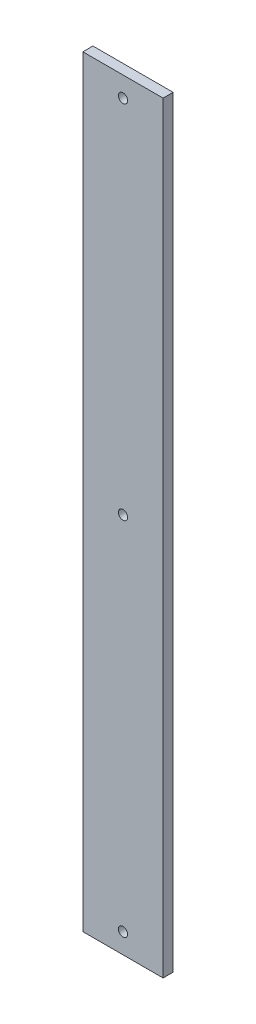
ISO-10303-21;
HEADER;
FILE_DESCRIPTION(('STEP AP214'),'2;1');
FILE_NAME('part.step','',(''),(''),'','','');
FILE_SCHEMA(('AUTOMOTIVE_DESIGN { 1 0 10303 214 1 1 1 1 }'));
ENDSEC;
DATA;
#1=APPLICATION_CONTEXT('core data for automotive mechanical design processes');
#2=APPLICATION_PROTOCOL_DEFINITION('international standard','automotive_design',2000,#1);
#3=PRODUCT_CONTEXT('',#1,'mechanical');
#4=PRODUCT('Part','Part','',(#3));
#5=PRODUCT_RELATED_PRODUCT_CATEGORY('part','',(#4));
#6=PRODUCT_DEFINITION_FORMATION('','',#4);
#7=PRODUCT_DEFINITION_CONTEXT('part definition',#1,'design');
#8=PRODUCT_DEFINITION('design','',#6,#7);
#9=PRODUCT_DEFINITION_SHAPE('','',#8);
#10=(LENGTH_UNIT() NAMED_UNIT(*) SI_UNIT(.MILLI.,.METRE.));
#11=(NAMED_UNIT(*) PLANE_ANGLE_UNIT() SI_UNIT($,.RADIAN.));
#12=(NAMED_UNIT(*) SI_UNIT($,.STERADIAN.) SOLID_ANGLE_UNIT());
#13=UNCERTAINTY_MEASURE_WITH_UNIT(LENGTH_MEASURE(1.E-05),#10,'distance_accuracy_value','');
#14=(GEOMETRIC_REPRESENTATION_CONTEXT(3) GLOBAL_UNCERTAINTY_ASSIGNED_CONTEXT((#13)) GLOBAL_UNIT_ASSIGNED_CONTEXT((#10,
#11,#12)) REPRESENTATION_CONTEXT('',''));
#15=CARTESIAN_POINT('',(0.,0.,0.));
#16=DIRECTION('',(0.,0.,1.));
#17=DIRECTION('',(1.,0.,0.));
#18=AXIS2_PLACEMENT_3D('',#15,#16,#17);
#19=CARTESIAN_POINT('',(0.,0.,3.175));
#20=DIRECTION('',(0.,0.,-1.));
#21=DIRECTION('',(-1.,0.,0.));
#22=AXIS2_PLACEMENT_3D('',#19,#20,#21);
#23=PLANE('',#22);
#24=DIRECTION('',(0.,-1.,0.));
#25=VECTOR('',#24,1.);
#26=CARTESIAN_POINT('',(0.,0.,3.175));
#27=LINE('',#26,#25);
#28=CARTESIAN_POINT('',(0.,241.3,3.175));
#29=VERTEX_POINT('',#28);
#30=CARTESIAN_POINT('',(0.,0.,3.175));
#31=VERTEX_POINT('',#30);
#32=EDGE_CURVE('E94',#29,#31,#27,.T.);
#33=ORIENTED_EDGE('',*,*,#32,.T.);
#34=DIRECTION('',(1.,0.,0.));
#35=VECTOR('',#34,1.);
#36=CARTESIAN_POINT('',(0.,0.,3.175));
#37=LINE('',#36,#35);
#38=CARTESIAN_POINT('',(25.4,0.,3.175));
#39=VERTEX_POINT('',#38);
#40=EDGE_CURVE('E89',#31,#39,#37,.T.);
#41=ORIENTED_EDGE('',*,*,#40,.T.);
#42=DIRECTION('',(0.,1.,0.));
#43=VECTOR('',#42,1.);
#44=CARTESIAN_POINT('',(25.4,0.,3.175));
#45=LINE('',#44,#43);
#46=CARTESIAN_POINT('',(25.4,241.3,3.175));
#47=VERTEX_POINT('',#46);
#48=EDGE_CURVE('E92',#39,#47,#45,.T.);
#49=ORIENTED_EDGE('',*,*,#48,.T.);
#50=DIRECTION('',(-1.,0.,0.));
#51=VECTOR('',#50,1.);
#52=CARTESIAN_POINT('',(0.,241.3,3.175));
#53=LINE('',#52,#51);
#54=EDGE_CURVE('E59',#47,#29,#53,.T.);
#55=ORIENTED_EDGE('',*,*,#54,.T.);
#56=EDGE_LOOP('',(#33,#41,#49,#55));
#57=FACE_BOUND('',#56,.T.);
#58=CARTESIAN_POINT('',(12.7,234.95,3.175));
#59=DIRECTION('',(0.,0.,1.));
#60=DIRECTION('',(1.,0.,0.));
#61=AXIS2_PLACEMENT_3D('',#58,#59,#60);
#62=CIRCLE('',#61,1.4605);
#63=CARTESIAN_POINT('',(14.1605,234.95,3.175));
#64=VERTEX_POINT('',#63);
#65=EDGE_CURVE('E109',#64,#64,#62,.T.);
#66=ORIENTED_EDGE('',*,*,#65,.F.);
#67=EDGE_LOOP('',(#66));
#68=FACE_BOUND('',#67,.T.);
#69=CARTESIAN_POINT('',(12.7,6.35,3.175));
#70=DIRECTION('',(0.,0.,1.));
#71=DIRECTION('',(1.,0.,0.));
#72=AXIS2_PLACEMENT_3D('',#69,#70,#71);
#73=CIRCLE('',#72,1.4605);
#74=CARTESIAN_POINT('',(14.1605,6.35,3.175));
#75=VERTEX_POINT('',#74);
#76=EDGE_CURVE('E124',#75,#75,#73,.T.);
#77=ORIENTED_EDGE('',*,*,#76,.F.);
#78=EDGE_LOOP('',(#77));
#79=FACE_BOUND('',#78,.T.);
#80=CARTESIAN_POINT('',(12.7,120.65,3.175));
#81=DIRECTION('',(0.,0.,1.));
#82=DIRECTION('',(1.,0.,0.));
#83=AXIS2_PLACEMENT_3D('',#80,#81,#82);
#84=CIRCLE('',#83,1.4605);
#85=CARTESIAN_POINT('',(14.1605,120.65,3.175));
#86=VERTEX_POINT('',#85);
#87=EDGE_CURVE('E130',#86,#86,#84,.T.);
#88=ORIENTED_EDGE('',*,*,#87,.F.);
#89=EDGE_LOOP('',(#88));
#90=FACE_BOUND('',#89,.T.);
#91=ADVANCED_FACE('F42',(#57,#68,#79,#90),#23,.F.);
#92=CARTESIAN_POINT('',(0.,0.,0.));
#93=DIRECTION('',(0.,0.,-1.));
#94=DIRECTION('',(-1.,0.,0.));
#95=AXIS2_PLACEMENT_3D('',#92,#93,#94);
#96=PLANE('',#95);
#97=CARTESIAN_POINT('',(12.7,6.35,0.));
#98=DIRECTION('',(0.,0.,1.));
#99=DIRECTION('',(1.,0.,0.));
#100=AXIS2_PLACEMENT_3D('',#97,#98,#99);
#101=CIRCLE('',#100,1.4605);
#102=CARTESIAN_POINT('',(14.1605,6.35,0.));
#103=VERTEX_POINT('',#102);
#104=EDGE_CURVE('E127',#103,#103,#101,.T.);
#105=ORIENTED_EDGE('',*,*,#104,.T.);
#106=EDGE_LOOP('',(#105));
#107=FACE_BOUND('',#106,.T.);
#108=DIRECTION('',(0.,-1.,0.));
#109=VECTOR('',#108,1.);
#110=CARTESIAN_POINT('',(0.,0.,0.));
#111=LINE('',#110,#109);
#112=CARTESIAN_POINT('',(0.,241.3,0.));
#113=VERTEX_POINT('',#112);
#114=CARTESIAN_POINT('',(0.,0.,0.));
#115=VERTEX_POINT('',#114);
#116=EDGE_CURVE('E106',#113,#115,#111,.T.);
#117=ORIENTED_EDGE('',*,*,#116,.F.);
#118=DIRECTION('',(-1.,0.,0.));
#119=VECTOR('',#118,1.);
#120=CARTESIAN_POINT('',(0.,241.3,0.));
#121=LINE('',#120,#119);
#122=CARTESIAN_POINT('',(25.4,241.3,0.));
#123=VERTEX_POINT('',#122);
#124=EDGE_CURVE('E82',#123,#113,#121,.T.);
#125=ORIENTED_EDGE('',*,*,#124,.F.);
#126=DIRECTION('',(0.,1.,0.));
#127=VECTOR('',#126,1.);
#128=CARTESIAN_POINT('',(25.4,0.,0.));
#129=LINE('',#128,#127);
#130=CARTESIAN_POINT('',(25.4,0.,0.));
#131=VERTEX_POINT('',#130);
#132=EDGE_CURVE('E76',#131,#123,#129,.T.);
#133=ORIENTED_EDGE('',*,*,#132,.F.);
#134=DIRECTION('',(1.,0.,0.));
#135=VECTOR('',#134,1.);
#136=CARTESIAN_POINT('',(0.,0.,0.));
#137=LINE('',#136,#135);
#138=EDGE_CURVE('E98',#115,#131,#137,.T.);
#139=ORIENTED_EDGE('',*,*,#138,.F.);
#140=EDGE_LOOP('',(#117,#125,#133,#139));
#141=FACE_BOUND('',#140,.T.);
#142=CARTESIAN_POINT('',(12.7,234.95,0.));
#143=DIRECTION('',(0.,0.,1.));
#144=DIRECTION('',(1.,0.,0.));
#145=AXIS2_PLACEMENT_3D('',#142,#143,#144);
#146=CIRCLE('',#145,1.4605);
#147=CARTESIAN_POINT('',(14.1605,234.95,0.));
#148=VERTEX_POINT('',#147);
#149=EDGE_CURVE('E121',#148,#148,#146,.T.);
#150=ORIENTED_EDGE('',*,*,#149,.T.);
#151=EDGE_LOOP('',(#150));
#152=FACE_BOUND('',#151,.T.);
#153=CARTESIAN_POINT('',(12.7,120.65,0.));
#154=DIRECTION('',(0.,0.,1.));
#155=DIRECTION('',(1.,0.,0.));
#156=AXIS2_PLACEMENT_3D('',#153,#154,#155);
#157=CIRCLE('',#156,1.4605);
#158=CARTESIAN_POINT('',(14.1605,120.65,0.));
#159=VERTEX_POINT('',#158);
#160=EDGE_CURVE('E133',#159,#159,#157,.T.);
#161=ORIENTED_EDGE('',*,*,#160,.T.);
#162=EDGE_LOOP('',(#161));
#163=FACE_BOUND('',#162,.T.);
#164=ADVANCED_FACE('F117',(#107,#141,#152,#163),#96,.T.);
#165=CARTESIAN_POINT('',(0.,0.,3.175));
#166=DIRECTION('',(1.,0.,0.));
#167=DIRECTION('',(0.,0.,-1.));
#168=AXIS2_PLACEMENT_3D('',#165,#166,#167);
#169=PLANE('',#168);
#170=ORIENTED_EDGE('',*,*,#116,.T.);
#171=DIRECTION('',(0.,0.,-1.));
#172=VECTOR('',#171,1.);
#173=CARTESIAN_POINT('',(0.,0.,3.175));
#174=LINE('',#173,#172);
#175=EDGE_CURVE('E11',#31,#115,#174,.T.);
#176=ORIENTED_EDGE('',*,*,#175,.F.);
#177=ORIENTED_EDGE('',*,*,#32,.F.);
#178=DIRECTION('',(0.,0.,-1.));
#179=VECTOR('',#178,1.);
#180=CARTESIAN_POINT('',(0.,241.3,3.175));
#181=LINE('',#180,#179);
#182=EDGE_CURVE('E102',#29,#113,#181,.T.);
#183=ORIENTED_EDGE('',*,*,#182,.T.);
#184=EDGE_LOOP('',(#170,#176,#177,#183));
#185=FACE_BOUND('',#184,.T.);
#186=ADVANCED_FACE('F44',(#185),#169,.F.);
#187=CARTESIAN_POINT('',(0.,0.,3.175));
#188=DIRECTION('',(0.,1.,0.));
#189=DIRECTION('',(0.,0.,1.));
#190=AXIS2_PLACEMENT_3D('',#187,#188,#189);
#191=PLANE('',#190);
#192=ORIENTED_EDGE('',*,*,#138,.T.);
#193=DIRECTION('',(0.,0.,-1.));
#194=VECTOR('',#193,1.);
#195=CARTESIAN_POINT('',(25.4,0.,3.175));
#196=LINE('',#195,#194);
#197=EDGE_CURVE('E51',#39,#131,#196,.T.);
#198=ORIENTED_EDGE('',*,*,#197,.F.);
#199=ORIENTED_EDGE('',*,*,#40,.F.);
#200=ORIENTED_EDGE('',*,*,#175,.T.);
#201=EDGE_LOOP('',(#192,#198,#199,#200));
#202=FACE_BOUND('',#201,.T.);
#203=ADVANCED_FACE('F97',(#202),#191,.F.);
#204=CARTESIAN_POINT('',(25.4,0.,3.175));
#205=DIRECTION('',(-1.,0.,0.));
#206=DIRECTION('',(0.,0.,1.));
#207=AXIS2_PLACEMENT_3D('',#204,#205,#206);
#208=PLANE('',#207);
#209=ORIENTED_EDGE('',*,*,#132,.T.);
#210=DIRECTION('',(0.,0.,-1.));
#211=VECTOR('',#210,1.);
#212=CARTESIAN_POINT('',(25.4,241.3,3.175));
#213=LINE('',#212,#211);
#214=EDGE_CURVE('E99',#47,#123,#213,.T.);
#215=ORIENTED_EDGE('',*,*,#214,.F.);
#216=ORIENTED_EDGE('',*,*,#48,.F.);
#217=ORIENTED_EDGE('',*,*,#197,.T.);
#218=EDGE_LOOP('',(#209,#215,#216,#217));
#219=FACE_BOUND('',#218,.T.);
#220=ADVANCED_FACE('F100',(#219),#208,.F.);
#221=CARTESIAN_POINT('',(0.,241.3,3.175));
#222=DIRECTION('',(0.,-1.,0.));
#223=DIRECTION('',(0.,0.,-1.));
#224=AXIS2_PLACEMENT_3D('',#221,#222,#223);
#225=PLANE('',#224);
#226=ORIENTED_EDGE('',*,*,#124,.T.);
#227=ORIENTED_EDGE('',*,*,#182,.F.);
#228=ORIENTED_EDGE('',*,*,#54,.F.);
#229=ORIENTED_EDGE('',*,*,#214,.T.);
#230=EDGE_LOOP('',(#226,#227,#228,#229));
#231=FACE_BOUND('',#230,.T.);
#232=ADVANCED_FACE('F114',(#231),#225,.F.);
#233=CARTESIAN_POINT('',(12.7,234.95,3.175));
#234=DIRECTION('',(0.,0.,-1.));
#235=DIRECTION('',(-1.,0.,0.));
#236=AXIS2_PLACEMENT_3D('',#233,#234,#235);
#237=CYLINDRICAL_SURFACE('',#236,1.4605);
#238=ORIENTED_EDGE('',*,*,#65,.T.);
#239=EDGE_LOOP('',(#238));
#240=FACE_BOUND('',#239,.T.);
#241=ORIENTED_EDGE('',*,*,#149,.F.);
#242=EDGE_LOOP('',(#241));
#243=FACE_BOUND('',#242,.T.);
#244=ADVANCED_FACE('F150',(#240,#243),#237,.F.);
#245=CARTESIAN_POINT('',(12.7,6.35,3.175));
#246=DIRECTION('',(0.,0.,-1.));
#247=DIRECTION('',(-1.,0.,0.));
#248=AXIS2_PLACEMENT_3D('',#245,#246,#247);
#249=CYLINDRICAL_SURFACE('',#248,1.4605);
#250=ORIENTED_EDGE('',*,*,#76,.T.);
#251=EDGE_LOOP('',(#250));
#252=FACE_BOUND('',#251,.T.);
#253=ORIENTED_EDGE('',*,*,#104,.F.);
#254=EDGE_LOOP('',(#253));
#255=FACE_BOUND('',#254,.T.);
#256=ADVANCED_FACE('F195',(#252,#255),#249,.F.);
#257=CARTESIAN_POINT('',(12.7,120.65,3.175));
#258=DIRECTION('',(0.,0.,-1.));
#259=DIRECTION('',(-1.,0.,0.));
#260=AXIS2_PLACEMENT_3D('',#257,#258,#259);
#261=CYLINDRICAL_SURFACE('',#260,1.4605);
#262=ORIENTED_EDGE('',*,*,#87,.T.);
#263=EDGE_LOOP('',(#262));
#264=FACE_BOUND('',#263,.T.);
#265=ORIENTED_EDGE('',*,*,#160,.F.);
#266=EDGE_LOOP('',(#265));
#267=FACE_BOUND('',#266,.T.);
#268=ADVANCED_FACE('F139',(#264,#267),#261,.F.);
#269=CLOSED_SHELL('',(#91,#164,#186,#203,#220,#232,#244,#256,#268));
#270=MANIFOLD_SOLID_BREP('B2',#269);
#271=ADVANCED_BREP_SHAPE_REPRESENTATION('',(#18,#270),#14);
#272=SHAPE_DEFINITION_REPRESENTATION(#9,#271);
ENDSEC;
END-ISO-10303-21;
